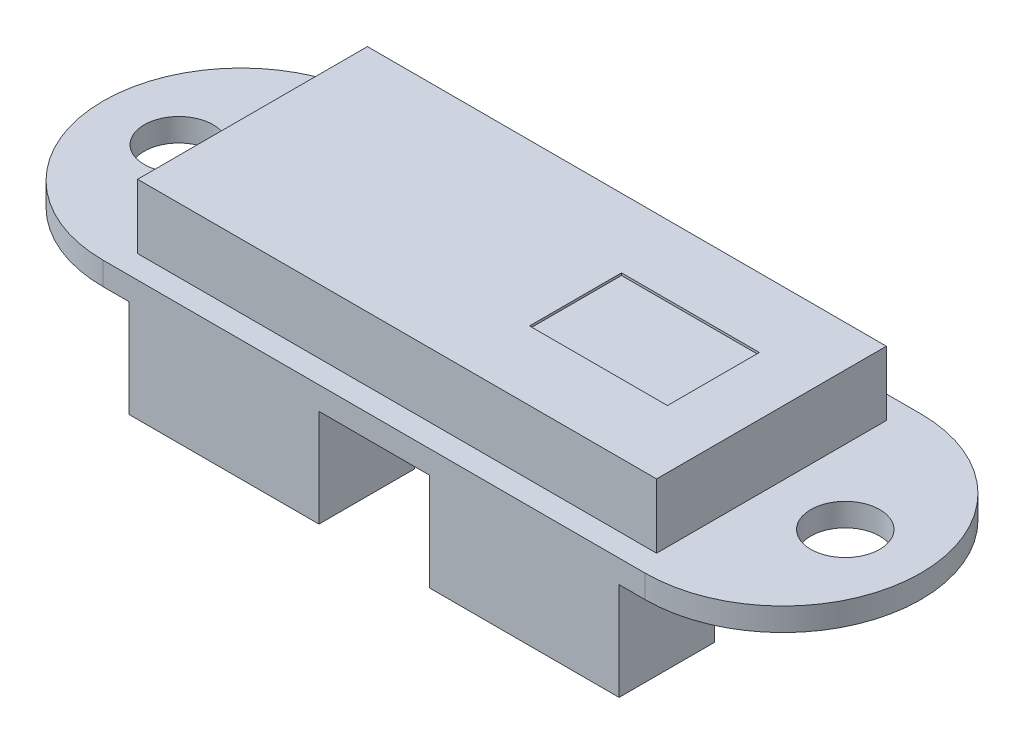
ISO-10303-21;
HEADER;
FILE_DESCRIPTION(('STEP AP214'),'2;1');
FILE_NAME('part.step','',(''),(''),'','','');
FILE_SCHEMA(('AUTOMOTIVE_DESIGN { 1 0 10303 214 1 1 1 1 }'));
ENDSEC;
DATA;
#1=APPLICATION_CONTEXT('core data for automotive mechanical design processes');
#2=APPLICATION_PROTOCOL_DEFINITION('international standard','automotive_design',2000,#1);
#3=PRODUCT_CONTEXT('',#1,'mechanical');
#4=PRODUCT('Part','Part','',(#3));
#5=PRODUCT_RELATED_PRODUCT_CATEGORY('part','',(#4));
#6=PRODUCT_DEFINITION_FORMATION('','',#4);
#7=PRODUCT_DEFINITION_CONTEXT('part definition',#1,'design');
#8=PRODUCT_DEFINITION('design','',#6,#7);
#9=PRODUCT_DEFINITION_SHAPE('','',#8);
#10=(LENGTH_UNIT() NAMED_UNIT(*) SI_UNIT(.MILLI.,.METRE.));
#11=(NAMED_UNIT(*) PLANE_ANGLE_UNIT() SI_UNIT($,.RADIAN.));
#12=(NAMED_UNIT(*) SI_UNIT($,.STERADIAN.) SOLID_ANGLE_UNIT());
#13=UNCERTAINTY_MEASURE_WITH_UNIT(LENGTH_MEASURE(1.E-05),#10,'distance_accuracy_value','');
#14=(GEOMETRIC_REPRESENTATION_CONTEXT(3) GLOBAL_UNCERTAINTY_ASSIGNED_CONTEXT((#13)) GLOBAL_UNIT_ASSIGNED_CONTEXT((#10,
#11,#12)) REPRESENTATION_CONTEXT('',''));
#15=CARTESIAN_POINT('',(0.,0.,0.));
#16=DIRECTION('',(0.,0.,1.));
#17=DIRECTION('',(1.,0.,0.));
#18=AXIS2_PLACEMENT_3D('',#15,#16,#17);
#19=CARTESIAN_POINT('',(0.,-1.,0.));
#20=DIRECTION('',(0.,-1.,0.));
#21=DIRECTION('',(0.,0.,-1.));
#22=AXIS2_PLACEMENT_3D('',#19,#20,#21);
#23=PLANE('',#22);
#24=DIRECTION('',(0.,0.,-1.));
#25=VECTOR('',#24,1.);
#26=CARTESIAN_POINT('',(3.84,-1.,6.));
#27=LINE('',#26,#25);
#28=CARTESIAN_POINT('',(3.84,-1.,6.));
#29=VERTEX_POINT('',#28);
#30=CARTESIAN_POINT('',(3.84,-1.,1.84));
#31=VERTEX_POINT('',#30);
#32=EDGE_CURVE('E295',#29,#31,#27,.T.);
#33=ORIENTED_EDGE('',*,*,#32,.F.);
#34=DIRECTION('',(-1.,0.,0.));
#35=VECTOR('',#34,1.);
#36=CARTESIAN_POINT('',(32.29,-1.,6.));
#37=LINE('',#36,#35);
#38=CARTESIAN_POINT('',(2.71,-1.,6.));
#39=VERTEX_POINT('',#38);
#40=EDGE_CURVE('E174',#29,#39,#37,.T.);
#41=ORIENTED_EDGE('',*,*,#40,.T.);
#42=CARTESIAN_POINT('',(2.71,-1.,0.));
#43=DIRECTION('',(0.,-1.,0.));
#44=DIRECTION('',(0.,0.,-1.));
#45=AXIS2_PLACEMENT_3D('',#42,#43,#44);
#46=CIRCLE('',#45,6.);
#47=CARTESIAN_POINT('',(2.71,-1.,-6.));
#48=VERTEX_POINT('',#47);
#49=EDGE_CURVE('E29',#39,#48,#46,.T.);
#50=ORIENTED_EDGE('',*,*,#49,.T.);
#51=DIRECTION('',(1.,0.,0.));
#52=VECTOR('',#51,1.);
#53=CARTESIAN_POINT('',(-3.29,-1.,-6.));
#54=LINE('',#53,#52);
#55=CARTESIAN_POINT('',(26.29,-1.,-6.));
#56=VERTEX_POINT('',#55);
#57=EDGE_CURVE('E151',#48,#56,#54,.T.);
#58=ORIENTED_EDGE('',*,*,#57,.T.);
#59=CARTESIAN_POINT('',(26.29,-1.,0.));
#60=DIRECTION('',(0.,-1.,0.));
#61=DIRECTION('',(0.,0.,-1.));
#62=AXIS2_PLACEMENT_3D('',#59,#60,#61);
#63=CIRCLE('',#62,6.);
#64=CARTESIAN_POINT('',(26.29,-1.,6.));
#65=VERTEX_POINT('',#64);
#66=EDGE_CURVE('E134',#56,#65,#63,.T.);
#67=ORIENTED_EDGE('',*,*,#66,.T.);
#68=CARTESIAN_POINT('',(25.16,-1.,6.));
#69=VERTEX_POINT('',#68);
#70=EDGE_CURVE('E170',#65,#69,#37,.T.);
#71=ORIENTED_EDGE('',*,*,#70,.T.);
#72=DIRECTION('',(0.,0.,-1.));
#73=VECTOR('',#72,1.);
#74=CARTESIAN_POINT('',(25.16,-1.,6.));
#75=LINE('',#74,#73);
#76=CARTESIAN_POINT('',(25.16,-1.,1.84));
#77=VERTEX_POINT('',#76);
#78=EDGE_CURVE('E249',#69,#77,#75,.T.);
#79=ORIENTED_EDGE('',*,*,#78,.T.);
#80=DIRECTION('',(-1.,0.,0.));
#81=VECTOR('',#80,1.);
#82=CARTESIAN_POINT('',(25.16,-1.,1.84));
#83=LINE('',#82,#81);
#84=CARTESIAN_POINT('',(16.9,-1.,1.84));
#85=VERTEX_POINT('',#84);
#86=EDGE_CURVE('E253',#77,#85,#83,.T.);
#87=ORIENTED_EDGE('',*,*,#86,.T.);
#88=DIRECTION('',(0.,0.,1.));
#89=VECTOR('',#88,1.);
#90=CARTESIAN_POINT('',(16.9,-1.,1.84));
#91=LINE('',#90,#89);
#92=CARTESIAN_POINT('',(16.9,-1.,6.));
#93=VERTEX_POINT('',#92);
#94=EDGE_CURVE('E255',#85,#93,#91,.T.);
#95=ORIENTED_EDGE('',*,*,#94,.T.);
#96=CARTESIAN_POINT('',(12.1,-1.,6.));
#97=VERTEX_POINT('',#96);
#98=EDGE_CURVE('E178',#93,#97,#37,.T.);
#99=ORIENTED_EDGE('',*,*,#98,.T.);
#100=DIRECTION('',(0.,0.,1.));
#101=VECTOR('',#100,1.);
#102=CARTESIAN_POINT('',(12.1,-1.,1.84));
#103=LINE('',#102,#101);
#104=CARTESIAN_POINT('',(12.1,-1.,1.84));
#105=VERTEX_POINT('',#104);
#106=EDGE_CURVE('E294',#105,#97,#103,.T.);
#107=ORIENTED_EDGE('',*,*,#106,.F.);
#108=DIRECTION('',(1.,0.,0.));
#109=VECTOR('',#108,1.);
#110=CARTESIAN_POINT('',(3.84,-1.,1.84));
#111=LINE('',#110,#109);
#112=EDGE_CURVE('E291',#31,#105,#111,.T.);
#113=ORIENTED_EDGE('',*,*,#112,.F.);
#114=EDGE_LOOP('',(#33,#41,#50,#58,#67,#71,#79,#87,#95,#99,#107,#113));
#115=FACE_BOUND('',#114,.T.);
#116=CARTESIAN_POINT('',(0.,-1.,0.));
#117=DIRECTION('',(0.,1.,0.));
#118=DIRECTION('',(1.,0.,0.));
#119=AXIS2_PLACEMENT_3D('',#116,#117,#118);
#120=CIRCLE('',#119,1.5);
#121=CARTESIAN_POINT('',(1.5,-1.,0.));
#122=VERTEX_POINT('',#121);
#123=EDGE_CURVE('E146',#122,#122,#120,.T.);
#124=ORIENTED_EDGE('',*,*,#123,.T.);
#125=EDGE_LOOP('',(#124));
#126=FACE_BOUND('',#125,.T.);
#127=CARTESIAN_POINT('',(29.,-1.,0.));
#128=DIRECTION('',(0.,1.,0.));
#129=DIRECTION('',(1.,0.,0.));
#130=AXIS2_PLACEMENT_3D('',#127,#128,#129);
#131=CIRCLE('',#130,1.5);
#132=CARTESIAN_POINT('',(30.5,-1.,0.));
#133=VERTEX_POINT('',#132);
#134=EDGE_CURVE('E166',#133,#133,#131,.T.);
#135=ORIENTED_EDGE('',*,*,#134,.T.);
#136=EDGE_LOOP('',(#135));
#137=FACE_BOUND('',#136,.T.);
#138=ADVANCED_FACE('F18',(#115,#126,#137),#23,.T.);
#139=CARTESIAN_POINT('',(-3.29,-1.,-6.));
#140=DIRECTION('',(0.,0.,1.));
#141=DIRECTION('',(1.,0.,0.));
#142=AXIS2_PLACEMENT_3D('',#139,#140,#141);
#143=PLANE('',#142);
#144=ORIENTED_EDGE('',*,*,#57,.F.);
#145=DIRECTION('',(0.,1.,0.));
#146=VECTOR('',#145,1.);
#147=CARTESIAN_POINT('',(2.71,-1.,-6.));
#148=LINE('',#147,#146);
#149=CARTESIAN_POINT('',(2.71,0.,-6.));
#150=VERTEX_POINT('',#149);
#151=EDGE_CURVE('E11',#48,#150,#148,.T.);
#152=ORIENTED_EDGE('',*,*,#151,.T.);
#153=DIRECTION('',(1.,0.,0.));
#154=VECTOR('',#153,1.);
#155=CARTESIAN_POINT('',(-3.29,0.,-6.));
#156=LINE('',#155,#154);
#157=CARTESIAN_POINT('',(26.29,0.,-6.));
#158=VERTEX_POINT('',#157);
#159=EDGE_CURVE('E110',#150,#158,#156,.T.);
#160=ORIENTED_EDGE('',*,*,#159,.T.);
#161=DIRECTION('',(0.,1.,0.));
#162=VECTOR('',#161,1.);
#163=CARTESIAN_POINT('',(26.29,-1.,-6.));
#164=LINE('',#163,#162);
#165=EDGE_CURVE('E130',#158,#56,#164,.F.);
#166=ORIENTED_EDGE('',*,*,#165,.T.);
#167=EDGE_LOOP('',(#144,#152,#160,#166));
#168=FACE_BOUND('',#167,.T.);
#169=ADVANCED_FACE('F427',(#168),#143,.F.);
#170=CARTESIAN_POINT('',(32.29,-1.,6.));
#171=DIRECTION('',(0.,0.,-1.));
#172=DIRECTION('',(-1.,0.,0.));
#173=AXIS2_PLACEMENT_3D('',#170,#171,#172);
#174=PLANE('',#173);
#175=DIRECTION('',(-1.,0.,0.));
#176=VECTOR('',#175,1.);
#177=CARTESIAN_POINT('',(32.29,0.,6.));
#178=LINE('',#177,#176);
#179=CARTESIAN_POINT('',(26.29,0.,6.));
#180=VERTEX_POINT('',#179);
#181=CARTESIAN_POINT('',(2.71,0.,6.));
#182=VERTEX_POINT('',#181);
#183=EDGE_CURVE('E156',#180,#182,#178,.T.);
#184=ORIENTED_EDGE('',*,*,#183,.T.);
#185=DIRECTION('',(0.,1.,0.));
#186=VECTOR('',#185,1.);
#187=CARTESIAN_POINT('',(2.71,-1.,6.));
#188=LINE('',#187,#186);
#189=EDGE_CURVE('E122',#182,#39,#188,.F.);
#190=ORIENTED_EDGE('',*,*,#189,.T.);
#191=ORIENTED_EDGE('',*,*,#40,.F.);
#192=DIRECTION('',(0.,1.,0.));
#193=VECTOR('',#192,1.);
#194=CARTESIAN_POINT('',(3.84,-5.25,6.));
#195=LINE('',#194,#193);
#196=CARTESIAN_POINT('',(3.84,-5.25,6.));
#197=VERTEX_POINT('',#196);
#198=EDGE_CURVE('E284',#197,#29,#195,.T.);
#199=ORIENTED_EDGE('',*,*,#198,.F.);
#200=DIRECTION('',(-1.,0.,0.));
#201=VECTOR('',#200,1.);
#202=CARTESIAN_POINT('',(12.1,-5.25,6.));
#203=LINE('',#202,#201);
#204=CARTESIAN_POINT('',(12.1,-5.25,6.));
#205=VERTEX_POINT('',#204);
#206=EDGE_CURVE('E309',#205,#197,#203,.T.);
#207=ORIENTED_EDGE('',*,*,#206,.F.);
#208=DIRECTION('',(0.,1.,0.));
#209=VECTOR('',#208,1.);
#210=CARTESIAN_POINT('',(12.1,-5.25,6.));
#211=LINE('',#210,#209);
#212=EDGE_CURVE('E280',#205,#97,#211,.T.);
#213=ORIENTED_EDGE('',*,*,#212,.T.);
#214=ORIENTED_EDGE('',*,*,#98,.F.);
#215=DIRECTION('',(0.,1.,0.));
#216=VECTOR('',#215,1.);
#217=CARTESIAN_POINT('',(16.9,-5.25,6.));
#218=LINE('',#217,#216);
#219=CARTESIAN_POINT('',(16.9,-5.25,6.));
#220=VERTEX_POINT('',#219);
#221=EDGE_CURVE('E241',#220,#93,#218,.T.);
#222=ORIENTED_EDGE('',*,*,#221,.F.);
#223=DIRECTION('',(1.,0.,0.));
#224=VECTOR('',#223,1.);
#225=CARTESIAN_POINT('',(25.16,-5.25,6.));
#226=LINE('',#225,#224);
#227=CARTESIAN_POINT('',(25.16,-5.25,6.));
#228=VERTEX_POINT('',#227);
#229=EDGE_CURVE('E248',#220,#228,#226,.T.);
#230=ORIENTED_EDGE('',*,*,#229,.T.);
#231=DIRECTION('',(0.,1.,0.));
#232=VECTOR('',#231,1.);
#233=CARTESIAN_POINT('',(25.16,-5.25,6.));
#234=LINE('',#233,#232);
#235=EDGE_CURVE('E244',#228,#69,#234,.T.);
#236=ORIENTED_EDGE('',*,*,#235,.T.);
#237=ORIENTED_EDGE('',*,*,#70,.F.);
#238=DIRECTION('',(0.,1.,0.));
#239=VECTOR('',#238,1.);
#240=CARTESIAN_POINT('',(26.29,-1.,6.));
#241=LINE('',#240,#239);
#242=EDGE_CURVE('E142',#65,#180,#241,.T.);
#243=ORIENTED_EDGE('',*,*,#242,.T.);
#244=EDGE_LOOP('',(#184,#190,#191,#199,#207,#213,#214,#222,#230,#236,#237,#243));
#245=FACE_BOUND('',#244,.T.);
#246=ADVANCED_FACE('F333',(#245),#174,.F.);
#247=CARTESIAN_POINT('',(29.,-1.,0.));
#248=DIRECTION('',(0.,1.,0.));
#249=DIRECTION('',(0.,0.,1.));
#250=AXIS2_PLACEMENT_3D('',#247,#248,#249);
#251=CYLINDRICAL_SURFACE('',#250,1.5);
#252=ORIENTED_EDGE('',*,*,#134,.F.);
#253=EDGE_LOOP('',(#252));
#254=FACE_BOUND('',#253,.T.);
#255=CARTESIAN_POINT('',(29.,0.,0.));
#256=DIRECTION('',(0.,1.,0.));
#257=DIRECTION('',(1.,0.,0.));
#258=AXIS2_PLACEMENT_3D('',#255,#256,#257);
#259=CIRCLE('',#258,1.5);
#260=CARTESIAN_POINT('',(30.5,0.,0.));
#261=VERTEX_POINT('',#260);
#262=EDGE_CURVE('E152',#261,#261,#259,.T.);
#263=ORIENTED_EDGE('',*,*,#262,.T.);
#264=EDGE_LOOP('',(#263));
#265=FACE_BOUND('',#264,.T.);
#266=ADVANCED_FACE('F447',(#254,#265),#251,.F.);
#267=CARTESIAN_POINT('',(0.,-1.,0.));
#268=DIRECTION('',(0.,1.,0.));
#269=DIRECTION('',(0.,0.,1.));
#270=AXIS2_PLACEMENT_3D('',#267,#268,#269);
#271=CYLINDRICAL_SURFACE('',#270,1.5);
#272=ORIENTED_EDGE('',*,*,#123,.F.);
#273=EDGE_LOOP('',(#272));
#274=FACE_BOUND('',#273,.T.);
#275=CARTESIAN_POINT('',(0.,0.,0.));
#276=DIRECTION('',(0.,1.,0.));
#277=DIRECTION('',(1.,0.,0.));
#278=AXIS2_PLACEMENT_3D('',#275,#276,#277);
#279=CIRCLE('',#278,1.5);
#280=CARTESIAN_POINT('',(1.5,0.,0.));
#281=VERTEX_POINT('',#280);
#282=EDGE_CURVE('E147',#281,#281,#279,.T.);
#283=ORIENTED_EDGE('',*,*,#282,.T.);
#284=EDGE_LOOP('',(#283));
#285=FACE_BOUND('',#284,.T.);
#286=ADVANCED_FACE('F443',(#274,#285),#271,.F.);
#287=CARTESIAN_POINT('',(0.,0.,0.));
#288=DIRECTION('',(0.,-1.,0.));
#289=DIRECTION('',(0.,0.,-1.));
#290=AXIS2_PLACEMENT_3D('',#287,#288,#289);
#291=PLANE('',#290);
#292=DIRECTION('',(0.,0.,1.));
#293=VECTOR('',#292,1.);
#294=CARTESIAN_POINT('',(25.79,0.,0.));
#295=LINE('',#294,#293);
#296=CARTESIAN_POINT('',(25.79,0.,-5.));
#297=VERTEX_POINT('',#296);
#298=CARTESIAN_POINT('',(25.79,0.,5.));
#299=VERTEX_POINT('',#298);
#300=EDGE_CURVE('E76',#297,#299,#295,.T.);
#301=ORIENTED_EDGE('',*,*,#300,.T.);
#302=DIRECTION('',(-1.,0.,0.));
#303=VECTOR('',#302,1.);
#304=CARTESIAN_POINT('',(27.,0.,5.));
#305=LINE('',#304,#303);
#306=CARTESIAN_POINT('',(3.21,0.,5.));
#307=VERTEX_POINT('',#306);
#308=EDGE_CURVE('E117',#299,#307,#305,.T.);
#309=ORIENTED_EDGE('',*,*,#308,.T.);
#310=DIRECTION('',(0.,0.,-1.));
#311=VECTOR('',#310,1.);
#312=CARTESIAN_POINT('',(3.21,0.,0.));
#313=LINE('',#312,#311);
#314=CARTESIAN_POINT('',(3.21,0.,-5.));
#315=VERTEX_POINT('',#314);
#316=EDGE_CURVE('E115',#307,#315,#313,.T.);
#317=ORIENTED_EDGE('',*,*,#316,.T.);
#318=DIRECTION('',(1.,0.,0.));
#319=VECTOR('',#318,1.);
#320=CARTESIAN_POINT('',(2.,0.,-5.));
#321=LINE('',#320,#319);
#322=EDGE_CURVE('E105',#315,#297,#321,.T.);
#323=ORIENTED_EDGE('',*,*,#322,.T.);
#324=EDGE_LOOP('',(#301,#309,#317,#323));
#325=FACE_BOUND('',#324,.T.);
#326=ORIENTED_EDGE('',*,*,#282,.F.);
#327=EDGE_LOOP('',(#326));
#328=FACE_BOUND('',#327,.T.);
#329=ORIENTED_EDGE('',*,*,#262,.F.);
#330=EDGE_LOOP('',(#329));
#331=FACE_BOUND('',#330,.T.);
#332=ORIENTED_EDGE('',*,*,#159,.F.);
#333=CARTESIAN_POINT('',(2.71,0.,0.));
#334=DIRECTION('',(0.,-1.,0.));
#335=DIRECTION('',(0.,0.,-1.));
#336=AXIS2_PLACEMENT_3D('',#333,#334,#335);
#337=CIRCLE('',#336,6.);
#338=EDGE_CURVE('E126',#150,#182,#337,.F.);
#339=ORIENTED_EDGE('',*,*,#338,.T.);
#340=ORIENTED_EDGE('',*,*,#183,.F.);
#341=CARTESIAN_POINT('',(26.29,0.,0.));
#342=DIRECTION('',(0.,-1.,0.));
#343=DIRECTION('',(0.,0.,-1.));
#344=AXIS2_PLACEMENT_3D('',#341,#342,#343);
#345=CIRCLE('',#344,6.);
#346=EDGE_CURVE('E138',#180,#158,#345,.F.);
#347=ORIENTED_EDGE('',*,*,#346,.T.);
#348=EDGE_LOOP('',(#332,#339,#340,#347));
#349=FACE_BOUND('',#348,.T.);
#350=ADVANCED_FACE('F439',(#325,#328,#331,#349),#291,.F.);
#351=CARTESIAN_POINT('',(26.29,-1.,0.));
#352=DIRECTION('',(0.,1.,0.));
#353=DIRECTION('',(0.,0.,1.));
#354=AXIS2_PLACEMENT_3D('',#351,#352,#353);
#355=CYLINDRICAL_SURFACE('',#354,6.);
#356=ORIENTED_EDGE('',*,*,#66,.F.);
#357=ORIENTED_EDGE('',*,*,#165,.F.);
#358=ORIENTED_EDGE('',*,*,#346,.F.);
#359=ORIENTED_EDGE('',*,*,#242,.F.);
#360=EDGE_LOOP('',(#356,#357,#358,#359));
#361=FACE_BOUND('',#360,.T.);
#362=ADVANCED_FACE('F442',(#361),#355,.T.);
#363=CARTESIAN_POINT('',(2.71,-1.,0.));
#364=DIRECTION('',(0.,1.,0.));
#365=DIRECTION('',(0.,0.,1.));
#366=AXIS2_PLACEMENT_3D('',#363,#364,#365);
#367=CYLINDRICAL_SURFACE('',#366,6.);
#368=ORIENTED_EDGE('',*,*,#49,.F.);
#369=ORIENTED_EDGE('',*,*,#189,.F.);
#370=ORIENTED_EDGE('',*,*,#338,.F.);
#371=ORIENTED_EDGE('',*,*,#151,.F.);
#372=EDGE_LOOP('',(#368,#369,#370,#371));
#373=FACE_BOUND('',#372,.T.);
#374=ADVANCED_FACE('F456',(#373),#367,.T.);
#375=CARTESIAN_POINT('',(27.,2.8,5.));
#376=DIRECTION('',(0.,0.,1.));
#377=DIRECTION('',(1.,0.,0.));
#378=AXIS2_PLACEMENT_3D('',#375,#376,#377);
#379=PLANE('',#378);
#380=ORIENTED_EDGE('',*,*,#308,.F.);
#381=DIRECTION('',(0.,-1.,0.));
#382=VECTOR('',#381,1.);
#383=CARTESIAN_POINT('',(25.79,2.8,5.));
#384=LINE('',#383,#382);
#385=CARTESIAN_POINT('',(25.79,2.8,5.));
#386=VERTEX_POINT('',#385);
#387=EDGE_CURVE('E82',#386,#299,#384,.T.);
#388=ORIENTED_EDGE('',*,*,#387,.F.);
#389=DIRECTION('',(-1.,0.,0.));
#390=VECTOR('',#389,1.);
#391=CARTESIAN_POINT('',(27.,2.8,5.));
#392=LINE('',#391,#390);
#393=CARTESIAN_POINT('',(3.21,2.8,5.));
#394=VERTEX_POINT('',#393);
#395=EDGE_CURVE('E95',#386,#394,#392,.T.);
#396=ORIENTED_EDGE('',*,*,#395,.T.);
#397=DIRECTION('',(0.,-1.,0.));
#398=VECTOR('',#397,1.);
#399=CARTESIAN_POINT('',(3.21,2.8,5.));
#400=LINE('',#399,#398);
#401=EDGE_CURVE('E106',#394,#307,#400,.T.);
#402=ORIENTED_EDGE('',*,*,#401,.T.);
#403=EDGE_LOOP('',(#380,#388,#396,#402));
#404=FACE_BOUND('',#403,.T.);
#405=ADVANCED_FACE('F437',(#404),#379,.T.);
#406=CARTESIAN_POINT('',(3.21,2.8,0.));
#407=DIRECTION('',(-1.,0.,0.));
#408=DIRECTION('',(0.,0.,1.));
#409=AXIS2_PLACEMENT_3D('',#406,#407,#408);
#410=PLANE('',#409);
#411=ORIENTED_EDGE('',*,*,#316,.F.);
#412=ORIENTED_EDGE('',*,*,#401,.F.);
#413=DIRECTION('',(0.,0.,-1.));
#414=VECTOR('',#413,1.);
#415=CARTESIAN_POINT('',(3.21,2.8,5.));
#416=LINE('',#415,#414);
#417=CARTESIAN_POINT('',(3.21,2.8,-5.));
#418=VERTEX_POINT('',#417);
#419=EDGE_CURVE('E90',#394,#418,#416,.T.);
#420=ORIENTED_EDGE('',*,*,#419,.T.);
#421=DIRECTION('',(0.,-1.,0.));
#422=VECTOR('',#421,1.);
#423=CARTESIAN_POINT('',(3.21,2.8,-5.));
#424=LINE('',#423,#422);
#425=EDGE_CURVE('E81',#418,#315,#424,.T.);
#426=ORIENTED_EDGE('',*,*,#425,.T.);
#427=EDGE_LOOP('',(#411,#412,#420,#426));
#428=FACE_BOUND('',#427,.T.);
#429=ADVANCED_FACE('F460',(#428),#410,.T.);
#430=CARTESIAN_POINT('',(2.,2.8,-5.));
#431=DIRECTION('',(0.,0.,-1.));
#432=DIRECTION('',(-1.,0.,0.));
#433=AXIS2_PLACEMENT_3D('',#430,#431,#432);
#434=PLANE('',#433);
#435=ORIENTED_EDGE('',*,*,#322,.F.);
#436=ORIENTED_EDGE('',*,*,#425,.F.);
#437=DIRECTION('',(1.,0.,0.));
#438=VECTOR('',#437,1.);
#439=CARTESIAN_POINT('',(2.,2.8,-5.));
#440=LINE('',#439,#438);
#441=CARTESIAN_POINT('',(25.79,2.8,-5.));
#442=VERTEX_POINT('',#441);
#443=EDGE_CURVE('E85',#418,#442,#440,.T.);
#444=ORIENTED_EDGE('',*,*,#443,.T.);
#445=DIRECTION('',(0.,-1.,0.));
#446=VECTOR('',#445,1.);
#447=CARTESIAN_POINT('',(25.79,2.8,-5.));
#448=LINE('',#447,#446);
#449=EDGE_CURVE('E22',#442,#297,#448,.T.);
#450=ORIENTED_EDGE('',*,*,#449,.T.);
#451=EDGE_LOOP('',(#435,#436,#444,#450));
#452=FACE_BOUND('',#451,.T.);
#453=ADVANCED_FACE('F86',(#452),#434,.T.);
#454=CARTESIAN_POINT('',(25.79,2.8,0.));
#455=DIRECTION('',(1.,0.,0.));
#456=DIRECTION('',(0.,0.,-1.));
#457=AXIS2_PLACEMENT_3D('',#454,#455,#456);
#458=PLANE('',#457);
#459=ORIENTED_EDGE('',*,*,#300,.F.);
#460=ORIENTED_EDGE('',*,*,#449,.F.);
#461=DIRECTION('',(0.,0.,1.));
#462=VECTOR('',#461,1.);
#463=CARTESIAN_POINT('',(25.79,2.8,-5.));
#464=LINE('',#463,#462);
#465=EDGE_CURVE('E73',#442,#386,#464,.T.);
#466=ORIENTED_EDGE('',*,*,#465,.T.);
#467=ORIENTED_EDGE('',*,*,#387,.T.);
#468=EDGE_LOOP('',(#459,#460,#466,#467));
#469=FACE_BOUND('',#468,.T.);
#470=ADVANCED_FACE('F20',(#469),#458,.T.);
#471=CARTESIAN_POINT('',(0.,2.8,0.));
#472=DIRECTION('',(0.,-1.,0.));
#473=DIRECTION('',(0.,0.,-1.));
#474=AXIS2_PLACEMENT_3D('',#471,#472,#473);
#475=PLANE('',#474);
#476=DIRECTION('',(0.,0.,1.));
#477=VECTOR('',#476,1.);
#478=CARTESIAN_POINT('',(17.2626191808003,2.8,-2.));
#479=LINE('',#478,#477);
#480=CARTESIAN_POINT('',(17.2626191808003,2.8,-2.));
#481=VERTEX_POINT('',#480);
#482=CARTESIAN_POINT('',(17.2626191808003,2.8,2.));
#483=VERTEX_POINT('',#482);
#484=EDGE_CURVE('E207',#481,#483,#479,.T.);
#485=ORIENTED_EDGE('',*,*,#484,.F.);
#486=DIRECTION('',(-1.,0.,0.));
#487=VECTOR('',#486,1.);
#488=CARTESIAN_POINT('',(23.2626191808003,2.8,-2.));
#489=LINE('',#488,#487);
#490=CARTESIAN_POINT('',(23.2626191808003,2.8,-2.));
#491=VERTEX_POINT('',#490);
#492=EDGE_CURVE('E203',#491,#481,#489,.T.);
#493=ORIENTED_EDGE('',*,*,#492,.F.);
#494=DIRECTION('',(0.,0.,-1.));
#495=VECTOR('',#494,1.);
#496=CARTESIAN_POINT('',(23.2626191808003,2.8,2.));
#497=LINE('',#496,#495);
#498=CARTESIAN_POINT('',(23.2626191808003,2.8,2.));
#499=VERTEX_POINT('',#498);
#500=EDGE_CURVE('E209',#499,#491,#497,.T.);
#501=ORIENTED_EDGE('',*,*,#500,.F.);
#502=DIRECTION('',(1.,0.,0.));
#503=VECTOR('',#502,1.);
#504=CARTESIAN_POINT('',(17.2626191808003,2.8,2.));
#505=LINE('',#504,#503);
#506=EDGE_CURVE('E214',#483,#499,#505,.T.);
#507=ORIENTED_EDGE('',*,*,#506,.F.);
#508=EDGE_LOOP('',(#485,#493,#501,#507));
#509=FACE_BOUND('',#508,.T.);
#510=ORIENTED_EDGE('',*,*,#395,.F.);
#511=ORIENTED_EDGE('',*,*,#465,.F.);
#512=ORIENTED_EDGE('',*,*,#443,.F.);
#513=ORIENTED_EDGE('',*,*,#419,.F.);
#514=EDGE_LOOP('',(#510,#511,#512,#513));
#515=FACE_BOUND('',#514,.T.);
#516=ADVANCED_FACE('F93',(#509,#515),#475,.F.);
#517=CARTESIAN_POINT('',(23.2626191808003,2.7,-2.));
#518=DIRECTION('',(0.,0.,-1.));
#519=DIRECTION('',(-1.,0.,0.));
#520=AXIS2_PLACEMENT_3D('',#517,#518,#519);
#521=PLANE('',#520);
#522=ORIENTED_EDGE('',*,*,#492,.T.);
#523=DIRECTION('',(0.,1.,0.));
#524=VECTOR('',#523,1.);
#525=CARTESIAN_POINT('',(17.2626191808003,2.7,-2.));
#526=LINE('',#525,#524);
#527=CARTESIAN_POINT('',(17.2626191808003,2.7,-2.));
#528=VERTEX_POINT('',#527);
#529=EDGE_CURVE('E182',#528,#481,#526,.T.);
#530=ORIENTED_EDGE('',*,*,#529,.F.);
#531=DIRECTION('',(-1.,0.,0.));
#532=VECTOR('',#531,1.);
#533=CARTESIAN_POINT('',(23.2626191808003,2.7,-2.));
#534=LINE('',#533,#532);
#535=CARTESIAN_POINT('',(23.2626191808003,2.7,-2.));
#536=VERTEX_POINT('',#535);
#537=EDGE_CURVE('E213',#536,#528,#534,.T.);
#538=ORIENTED_EDGE('',*,*,#537,.F.);
#539=DIRECTION('',(0.,1.,0.));
#540=VECTOR('',#539,1.);
#541=CARTESIAN_POINT('',(23.2626191808003,2.7,-2.));
#542=LINE('',#541,#540);
#543=EDGE_CURVE('E198',#536,#491,#542,.T.);
#544=ORIENTED_EDGE('',*,*,#543,.T.);
#545=EDGE_LOOP('',(#522,#530,#538,#544));
#546=FACE_BOUND('',#545,.T.);
#547=ADVANCED_FACE('F411',(#546),#521,.F.);
#548=CARTESIAN_POINT('',(17.2626191808003,2.7,-2.));
#549=DIRECTION('',(-1.,0.,0.));
#550=DIRECTION('',(0.,0.,1.));
#551=AXIS2_PLACEMENT_3D('',#548,#549,#550);
#552=PLANE('',#551);
#553=ORIENTED_EDGE('',*,*,#484,.T.);
#554=DIRECTION('',(0.,1.,0.));
#555=VECTOR('',#554,1.);
#556=CARTESIAN_POINT('',(17.2626191808003,2.7,2.));
#557=LINE('',#556,#555);
#558=CARTESIAN_POINT('',(17.2626191808003,2.7,2.));
#559=VERTEX_POINT('',#558);
#560=EDGE_CURVE('E190',#559,#483,#557,.T.);
#561=ORIENTED_EDGE('',*,*,#560,.F.);
#562=DIRECTION('',(0.,0.,1.));
#563=VECTOR('',#562,1.);
#564=CARTESIAN_POINT('',(17.2626191808003,2.7,-2.));
#565=LINE('',#564,#563);
#566=EDGE_CURVE('E224',#528,#559,#565,.T.);
#567=ORIENTED_EDGE('',*,*,#566,.F.);
#568=ORIENTED_EDGE('',*,*,#529,.T.);
#569=EDGE_LOOP('',(#553,#561,#567,#568));
#570=FACE_BOUND('',#569,.T.);
#571=ADVANCED_FACE('F417',(#570),#552,.F.);
#572=CARTESIAN_POINT('',(17.2626191808003,2.7,2.));
#573=DIRECTION('',(0.,0.,1.));
#574=DIRECTION('',(1.,0.,0.));
#575=AXIS2_PLACEMENT_3D('',#572,#573,#574);
#576=PLANE('',#575);
#577=ORIENTED_EDGE('',*,*,#506,.T.);
#578=DIRECTION('',(0.,1.,0.));
#579=VECTOR('',#578,1.);
#580=CARTESIAN_POINT('',(23.2626191808003,2.7,2.));
#581=LINE('',#580,#579);
#582=CARTESIAN_POINT('',(23.2626191808003,2.7,2.));
#583=VERTEX_POINT('',#582);
#584=EDGE_CURVE('E194',#583,#499,#581,.T.);
#585=ORIENTED_EDGE('',*,*,#584,.F.);
#586=DIRECTION('',(1.,0.,0.));
#587=VECTOR('',#586,1.);
#588=CARTESIAN_POINT('',(17.2626191808003,2.7,2.));
#589=LINE('',#588,#587);
#590=EDGE_CURVE('E228',#559,#583,#589,.T.);
#591=ORIENTED_EDGE('',*,*,#590,.F.);
#592=ORIENTED_EDGE('',*,*,#560,.T.);
#593=EDGE_LOOP('',(#577,#585,#591,#592));
#594=FACE_BOUND('',#593,.T.);
#595=ADVANCED_FACE('F401',(#594),#576,.F.);
#596=CARTESIAN_POINT('',(23.2626191808003,2.7,2.));
#597=DIRECTION('',(1.,0.,0.));
#598=DIRECTION('',(0.,0.,-1.));
#599=AXIS2_PLACEMENT_3D('',#596,#597,#598);
#600=PLANE('',#599);
#601=ORIENTED_EDGE('',*,*,#500,.T.);
#602=ORIENTED_EDGE('',*,*,#543,.F.);
#603=DIRECTION('',(0.,0.,-1.));
#604=VECTOR('',#603,1.);
#605=CARTESIAN_POINT('',(23.2626191808003,2.7,2.));
#606=LINE('',#605,#604);
#607=EDGE_CURVE('E202',#583,#536,#606,.T.);
#608=ORIENTED_EDGE('',*,*,#607,.F.);
#609=ORIENTED_EDGE('',*,*,#584,.T.);
#610=EDGE_LOOP('',(#601,#602,#608,#609));
#611=FACE_BOUND('',#610,.T.);
#612=ADVANCED_FACE('F408',(#611),#600,.F.);
#613=CARTESIAN_POINT('',(0.,2.7,0.));
#614=DIRECTION('',(0.,1.,0.));
#615=DIRECTION('',(0.,0.,1.));
#616=AXIS2_PLACEMENT_3D('',#613,#614,#615);
#617=PLANE('',#616);
#618=ORIENTED_EDGE('',*,*,#537,.T.);
#619=ORIENTED_EDGE('',*,*,#566,.T.);
#620=ORIENTED_EDGE('',*,*,#590,.T.);
#621=ORIENTED_EDGE('',*,*,#607,.T.);
#622=EDGE_LOOP('',(#618,#619,#620,#621));
#623=FACE_BOUND('',#622,.T.);
#624=ADVANCED_FACE('F415',(#623),#617,.T.);
#625=CARTESIAN_POINT('',(25.16,-5.25,6.));
#626=DIRECTION('',(1.,0.,0.));
#627=DIRECTION('',(0.,0.,-1.));
#628=AXIS2_PLACEMENT_3D('',#625,#626,#627);
#629=PLANE('',#628);
#630=ORIENTED_EDGE('',*,*,#78,.F.);
#631=ORIENTED_EDGE('',*,*,#235,.F.);
#632=DIRECTION('',(0.,0.,-1.));
#633=VECTOR('',#632,1.);
#634=CARTESIAN_POINT('',(25.16,-5.25,6.));
#635=LINE('',#634,#633);
#636=CARTESIAN_POINT('',(25.16,-5.25,1.84));
#637=VERTEX_POINT('',#636);
#638=EDGE_CURVE('E259',#228,#637,#635,.T.);
#639=ORIENTED_EDGE('',*,*,#638,.T.);
#640=DIRECTION('',(0.,1.,0.));
#641=VECTOR('',#640,1.);
#642=CARTESIAN_POINT('',(25.16,-5.25,1.84));
#643=LINE('',#642,#641);
#644=EDGE_CURVE('E208',#637,#77,#643,.T.);
#645=ORIENTED_EDGE('',*,*,#644,.T.);
#646=EDGE_LOOP('',(#630,#631,#639,#645));
#647=FACE_BOUND('',#646,.T.);
#648=ADVANCED_FACE('F496',(#647),#629,.T.);
#649=CARTESIAN_POINT('',(25.16,-5.25,1.84));
#650=DIRECTION('',(0.,0.,-1.));
#651=DIRECTION('',(-1.,0.,0.));
#652=AXIS2_PLACEMENT_3D('',#649,#650,#651);
#653=PLANE('',#652);
#654=ORIENTED_EDGE('',*,*,#86,.F.);
#655=ORIENTED_EDGE('',*,*,#644,.F.);
#656=DIRECTION('',(-1.,0.,0.));
#657=VECTOR('',#656,1.);
#658=CARTESIAN_POINT('',(25.16,-5.25,1.84));
#659=LINE('',#658,#657);
#660=CARTESIAN_POINT('',(16.9,-5.25,1.84));
#661=VERTEX_POINT('',#660);
#662=EDGE_CURVE('E266',#637,#661,#659,.T.);
#663=ORIENTED_EDGE('',*,*,#662,.T.);
#664=DIRECTION('',(0.,1.,0.));
#665=VECTOR('',#664,1.);
#666=CARTESIAN_POINT('',(16.9,-5.25,1.84));
#667=LINE('',#666,#665);
#668=EDGE_CURVE('E237',#661,#85,#667,.T.);
#669=ORIENTED_EDGE('',*,*,#668,.T.);
#670=EDGE_LOOP('',(#654,#655,#663,#669));
#671=FACE_BOUND('',#670,.T.);
#672=ADVANCED_FACE('F499',(#671),#653,.T.);
#673=CARTESIAN_POINT('',(16.9,-5.25,1.84));
#674=DIRECTION('',(-1.,0.,0.));
#675=DIRECTION('',(0.,0.,1.));
#676=AXIS2_PLACEMENT_3D('',#673,#674,#675);
#677=PLANE('',#676);
#678=ORIENTED_EDGE('',*,*,#94,.F.);
#679=ORIENTED_EDGE('',*,*,#668,.F.);
#680=DIRECTION('',(0.,0.,1.));
#681=VECTOR('',#680,1.);
#682=CARTESIAN_POINT('',(16.9,-5.25,1.84));
#683=LINE('',#682,#681);
#684=EDGE_CURVE('E270',#661,#220,#683,.T.);
#685=ORIENTED_EDGE('',*,*,#684,.T.);
#686=ORIENTED_EDGE('',*,*,#221,.T.);
#687=EDGE_LOOP('',(#678,#679,#685,#686));
#688=FACE_BOUND('',#687,.T.);
#689=ADVANCED_FACE('F490',(#688),#677,.T.);
#690=CARTESIAN_POINT('',(0.,-5.25,0.));
#691=DIRECTION('',(0.,1.,0.));
#692=DIRECTION('',(0.,0.,1.));
#693=AXIS2_PLACEMENT_3D('',#690,#691,#692);
#694=PLANE('',#693);
#695=ORIENTED_EDGE('',*,*,#638,.F.);
#696=ORIENTED_EDGE('',*,*,#229,.F.);
#697=ORIENTED_EDGE('',*,*,#684,.F.);
#698=ORIENTED_EDGE('',*,*,#662,.F.);
#699=EDGE_LOOP('',(#695,#696,#697,#698));
#700=FACE_BOUND('',#699,.T.);
#701=ADVANCED_FACE('F493',(#700),#694,.F.);
#702=CARTESIAN_POINT('',(3.84,-5.25,1.84));
#703=DIRECTION('',(0.,0.,1.));
#704=DIRECTION('',(1.,0.,0.));
#705=AXIS2_PLACEMENT_3D('',#702,#703,#704);
#706=PLANE('',#705);
#707=ORIENTED_EDGE('',*,*,#112,.T.);
#708=DIRECTION('',(0.,1.,0.));
#709=VECTOR('',#708,1.);
#710=CARTESIAN_POINT('',(12.1,-5.25,1.84));
#711=LINE('',#710,#709);
#712=CARTESIAN_POINT('',(12.1,-5.25,1.84));
#713=VERTEX_POINT('',#712);
#714=EDGE_CURVE('E254',#713,#105,#711,.T.);
#715=ORIENTED_EDGE('',*,*,#714,.F.);
#716=DIRECTION('',(1.,0.,0.));
#717=VECTOR('',#716,1.);
#718=CARTESIAN_POINT('',(3.84,-5.25,1.84));
#719=LINE('',#718,#717);
#720=CARTESIAN_POINT('',(3.84,-5.25,1.84));
#721=VERTEX_POINT('',#720);
#722=EDGE_CURVE('E298',#721,#713,#719,.T.);
#723=ORIENTED_EDGE('',*,*,#722,.F.);
#724=DIRECTION('',(0.,1.,0.));
#725=VECTOR('',#724,1.);
#726=CARTESIAN_POINT('',(3.84,-5.25,1.84));
#727=LINE('',#726,#725);
#728=EDGE_CURVE('E38',#721,#31,#727,.T.);
#729=ORIENTED_EDGE('',*,*,#728,.T.);
#730=EDGE_LOOP('',(#707,#715,#723,#729));
#731=FACE_BOUND('',#730,.T.);
#732=ADVANCED_FACE('F547',(#731),#706,.F.);
#733=CARTESIAN_POINT('',(12.1,-5.25,1.84));
#734=DIRECTION('',(-1.,0.,0.));
#735=DIRECTION('',(0.,0.,1.));
#736=AXIS2_PLACEMENT_3D('',#733,#734,#735);
#737=PLANE('',#736);
#738=ORIENTED_EDGE('',*,*,#106,.T.);
#739=ORIENTED_EDGE('',*,*,#212,.F.);
#740=DIRECTION('',(0.,0.,1.));
#741=VECTOR('',#740,1.);
#742=CARTESIAN_POINT('',(12.1,-5.25,1.84));
#743=LINE('',#742,#741);
#744=EDGE_CURVE('E305',#713,#205,#743,.T.);
#745=ORIENTED_EDGE('',*,*,#744,.F.);
#746=ORIENTED_EDGE('',*,*,#714,.T.);
#747=EDGE_LOOP('',(#738,#739,#745,#746));
#748=FACE_BOUND('',#747,.T.);
#749=ADVANCED_FACE('F327',(#748),#737,.F.);
#750=CARTESIAN_POINT('',(3.84,-5.25,6.));
#751=DIRECTION('',(1.,0.,0.));
#752=DIRECTION('',(0.,0.,-1.));
#753=AXIS2_PLACEMENT_3D('',#750,#751,#752);
#754=PLANE('',#753);
#755=ORIENTED_EDGE('',*,*,#32,.T.);
#756=ORIENTED_EDGE('',*,*,#728,.F.);
#757=DIRECTION('',(0.,0.,-1.));
#758=VECTOR('',#757,1.);
#759=CARTESIAN_POINT('',(3.84,-5.25,6.));
#760=LINE('',#759,#758);
#761=EDGE_CURVE('E290',#197,#721,#760,.T.);
#762=ORIENTED_EDGE('',*,*,#761,.F.);
#763=ORIENTED_EDGE('',*,*,#198,.T.);
#764=EDGE_LOOP('',(#755,#756,#762,#763));
#765=FACE_BOUND('',#764,.T.);
#766=ADVANCED_FACE('F342',(#765),#754,.F.);
#767=CARTESIAN_POINT('',(0.,-5.25,0.));
#768=DIRECTION('',(0.,-1.,0.));
#769=DIRECTION('',(0.,0.,-1.));
#770=AXIS2_PLACEMENT_3D('',#767,#768,#769);
#771=PLANE('',#770);
#772=ORIENTED_EDGE('',*,*,#722,.T.);
#773=ORIENTED_EDGE('',*,*,#744,.T.);
#774=ORIENTED_EDGE('',*,*,#206,.T.);
#775=ORIENTED_EDGE('',*,*,#761,.T.);
#776=EDGE_LOOP('',(#772,#773,#774,#775));
#777=FACE_BOUND('',#776,.T.);
#778=ADVANCED_FACE('F319',(#777),#771,.T.);
#779=CLOSED_SHELL('',(#138,#169,#246,#266,#286,#350,#362,#374,#405,#429,#453,#470,#516,#547,
#571,#595,#612,#624,#648,#672,#689,#701,#732,#749,#766,#778));
#780=MANIFOLD_SOLID_BREP('B1',#779);
#781=ADVANCED_BREP_SHAPE_REPRESENTATION('',(#18,#780),#14);
#782=SHAPE_DEFINITION_REPRESENTATION(#9,#781);
ENDSEC;
END-ISO-10303-21;
